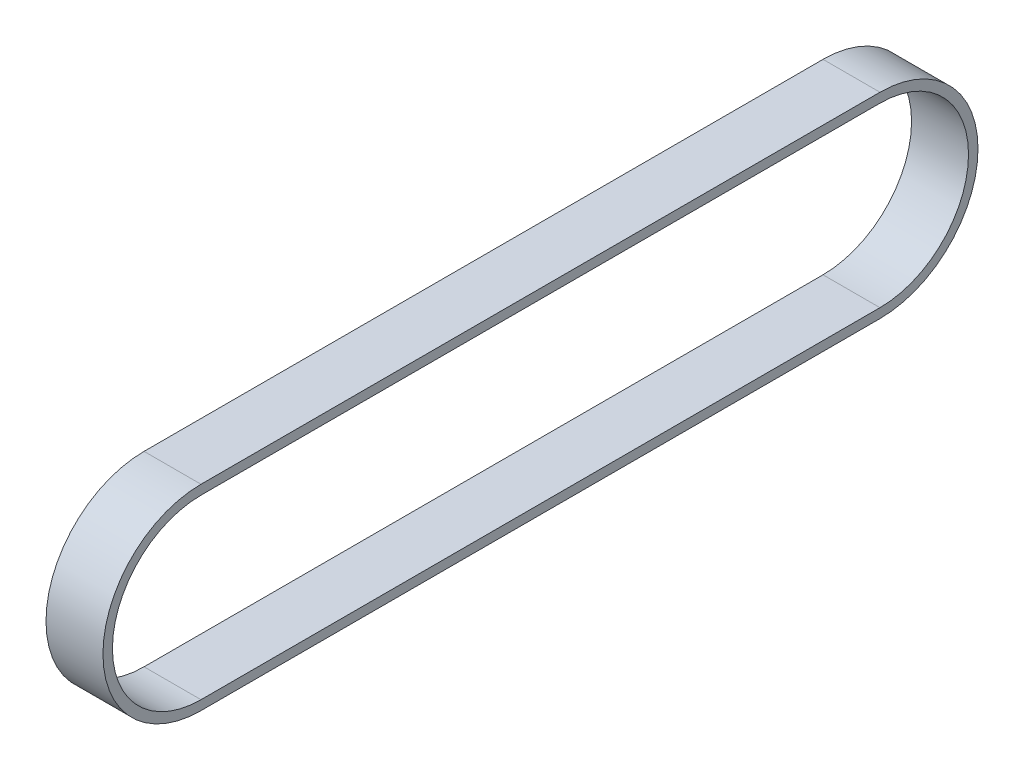
ISO-10303-21;
HEADER;
FILE_DESCRIPTION(('STEP AP214'),'2;1');
FILE_NAME('part.step','',(''),(''),'','','');
FILE_SCHEMA(('AUTOMOTIVE_DESIGN { 1 0 10303 214 1 1 1 1 }'));
ENDSEC;
DATA;
#1=APPLICATION_CONTEXT('core data for automotive mechanical design processes');
#2=APPLICATION_PROTOCOL_DEFINITION('international standard','automotive_design',2000,#1);
#3=PRODUCT_CONTEXT('',#1,'mechanical');
#4=PRODUCT('Part','Part','',(#3));
#5=PRODUCT_RELATED_PRODUCT_CATEGORY('part','',(#4));
#6=PRODUCT_DEFINITION_FORMATION('','',#4);
#7=PRODUCT_DEFINITION_CONTEXT('part definition',#1,'design');
#8=PRODUCT_DEFINITION('design','',#6,#7);
#9=PRODUCT_DEFINITION_SHAPE('','',#8);
#10=(LENGTH_UNIT() NAMED_UNIT(*) SI_UNIT(.MILLI.,.METRE.));
#11=(NAMED_UNIT(*) PLANE_ANGLE_UNIT() SI_UNIT($,.RADIAN.));
#12=(NAMED_UNIT(*) SI_UNIT($,.STERADIAN.) SOLID_ANGLE_UNIT());
#13=UNCERTAINTY_MEASURE_WITH_UNIT(LENGTH_MEASURE(1.E-05),#10,'distance_accuracy_value','');
#14=(GEOMETRIC_REPRESENTATION_CONTEXT(3) GLOBAL_UNCERTAINTY_ASSIGNED_CONTEXT((#13)) GLOBAL_UNIT_ASSIGNED_CONTEXT((#10,
#11,#12)) REPRESENTATION_CONTEXT('',''));
#15=CARTESIAN_POINT('',(0.,0.,0.));
#16=DIRECTION('',(0.,0.,1.));
#17=DIRECTION('',(1.,0.,0.));
#18=AXIS2_PLACEMENT_3D('',#15,#16,#17);
#19=CARTESIAN_POINT('',(3.,0.,71.545));
#20=DIRECTION('',(1.,0.,0.));
#21=DIRECTION('',(0.,0.,-1.));
#22=AXIS2_PLACEMENT_3D('',#19,#20,#21);
#23=PLANE('',#22);
#24=CARTESIAN_POINT('',(3.,0.,71.545));
#25=DIRECTION('',(1.,0.,0.));
#26=DIRECTION('',(0.,0.,-1.));
#27=AXIS2_PLACEMENT_3D('',#24,#25,#26);
#28=CIRCLE('',#27,10.33);
#29=CARTESIAN_POINT('',(3.,10.33,71.545));
#30=VERTEX_POINT('',#29);
#31=CARTESIAN_POINT('',(3.,-10.33,71.545));
#32=VERTEX_POINT('',#31);
#33=EDGE_CURVE('E164',#30,#32,#28,.T.);
#34=ORIENTED_EDGE('',*,*,#33,.T.);
#35=DIRECTION('',(0.,0.,-1.));
#36=VECTOR('',#35,1.);
#37=CARTESIAN_POINT('',(3.,-10.33,0.));
#38=LINE('',#37,#36);
#39=CARTESIAN_POINT('',(3.,-10.33,0.));
#40=VERTEX_POINT('',#39);
#41=EDGE_CURVE('E167',#32,#40,#38,.T.);
#42=ORIENTED_EDGE('',*,*,#41,.T.);
#43=CARTESIAN_POINT('',(3.,0.,0.));
#44=DIRECTION('',(1.,0.,0.));
#45=DIRECTION('',(0.,0.,-1.));
#46=AXIS2_PLACEMENT_3D('',#43,#44,#45);
#47=CIRCLE('',#46,10.33);
#48=CARTESIAN_POINT('',(3.,10.33,0.));
#49=VERTEX_POINT('',#48);
#50=EDGE_CURVE('E170',#40,#49,#47,.T.);
#51=ORIENTED_EDGE('',*,*,#50,.T.);
#52=DIRECTION('',(0.,0.,1.));
#53=VECTOR('',#52,1.);
#54=CARTESIAN_POINT('',(3.,10.33,71.545));
#55=LINE('',#54,#53);
#56=EDGE_CURVE('E172',#49,#30,#55,.T.);
#57=ORIENTED_EDGE('',*,*,#56,.T.);
#58=EDGE_LOOP('',(#34,#42,#51,#57));
#59=FACE_BOUND('',#58,.T.);
#60=DIRECTION('',(0.,0.,-1.));
#61=VECTOR('',#60,1.);
#62=CARTESIAN_POINT('',(3.,-9.33,0.));
#63=LINE('',#62,#61);
#64=CARTESIAN_POINT('',(3.,-9.33,71.545));
#65=VERTEX_POINT('',#64);
#66=CARTESIAN_POINT('',(3.,-9.33,0.));
#67=VERTEX_POINT('',#66);
#68=EDGE_CURVE('E136',#65,#67,#63,.T.);
#69=ORIENTED_EDGE('',*,*,#68,.F.);
#70=CARTESIAN_POINT('',(3.,0.,71.545));
#71=DIRECTION('',(1.,0.,0.));
#72=DIRECTION('',(0.,0.,-1.));
#73=AXIS2_PLACEMENT_3D('',#70,#71,#72);
#74=CIRCLE('',#73,9.33);
#75=CARTESIAN_POINT('',(3.,9.33,71.545));
#76=VERTEX_POINT('',#75);
#77=EDGE_CURVE('E128',#76,#65,#74,.T.);
#78=ORIENTED_EDGE('',*,*,#77,.F.);
#79=DIRECTION('',(0.,0.,1.));
#80=VECTOR('',#79,1.);
#81=CARTESIAN_POINT('',(3.,9.33,71.545));
#82=LINE('',#81,#80);
#83=CARTESIAN_POINT('',(3.,9.33,0.));
#84=VERTEX_POINT('',#83);
#85=EDGE_CURVE('E150',#84,#76,#82,.T.);
#86=ORIENTED_EDGE('',*,*,#85,.F.);
#87=CARTESIAN_POINT('',(3.,0.,0.));
#88=DIRECTION('',(1.,0.,0.));
#89=DIRECTION('',(0.,0.,-1.));
#90=AXIS2_PLACEMENT_3D('',#87,#88,#89);
#91=CIRCLE('',#90,9.33);
#92=EDGE_CURVE('E148',#67,#84,#91,.T.);
#93=ORIENTED_EDGE('',*,*,#92,.F.);
#94=EDGE_LOOP('',(#69,#78,#86,#93));
#95=FACE_BOUND('',#94,.T.);
#96=ADVANCED_FACE('F63',(#59,#95),#23,.T.);
#97=CARTESIAN_POINT('',(-3.,0.,71.545));
#98=DIRECTION('',(1.,0.,0.));
#99=DIRECTION('',(0.,0.,-1.));
#100=AXIS2_PLACEMENT_3D('',#97,#98,#99);
#101=PLANE('',#100);
#102=CARTESIAN_POINT('',(-3.,0.,71.545));
#103=DIRECTION('',(1.,0.,0.));
#104=DIRECTION('',(0.,0.,-1.));
#105=AXIS2_PLACEMENT_3D('',#102,#103,#104);
#106=CIRCLE('',#105,10.33);
#107=CARTESIAN_POINT('',(-3.,10.33,71.545));
#108=VERTEX_POINT('',#107);
#109=CARTESIAN_POINT('',(-3.,-10.33,71.545));
#110=VERTEX_POINT('',#109);
#111=EDGE_CURVE('E144',#108,#110,#106,.T.);
#112=ORIENTED_EDGE('',*,*,#111,.F.);
#113=DIRECTION('',(0.,0.,1.));
#114=VECTOR('',#113,1.);
#115=CARTESIAN_POINT('',(-3.,10.33,71.545));
#116=LINE('',#115,#114);
#117=CARTESIAN_POINT('',(-3.,10.33,0.));
#118=VERTEX_POINT('',#117);
#119=EDGE_CURVE('E168',#118,#108,#116,.T.);
#120=ORIENTED_EDGE('',*,*,#119,.F.);
#121=CARTESIAN_POINT('',(-3.,0.,0.));
#122=DIRECTION('',(1.,0.,0.));
#123=DIRECTION('',(0.,0.,-1.));
#124=AXIS2_PLACEMENT_3D('',#121,#122,#123);
#125=CIRCLE('',#124,10.33);
#126=CARTESIAN_POINT('',(-3.,-10.33,0.));
#127=VERTEX_POINT('',#126);
#128=EDGE_CURVE('E179',#127,#118,#125,.T.);
#129=ORIENTED_EDGE('',*,*,#128,.F.);
#130=DIRECTION('',(0.,0.,-1.));
#131=VECTOR('',#130,1.);
#132=CARTESIAN_POINT('',(-3.,-10.33,0.));
#133=LINE('',#132,#131);
#134=EDGE_CURVE('E177',#110,#127,#133,.T.);
#135=ORIENTED_EDGE('',*,*,#134,.F.);
#136=EDGE_LOOP('',(#112,#120,#129,#135));
#137=FACE_BOUND('',#136,.T.);
#138=CARTESIAN_POINT('',(-3.,0.,71.545));
#139=DIRECTION('',(1.,0.,0.));
#140=DIRECTION('',(0.,0.,-1.));
#141=AXIS2_PLACEMENT_3D('',#138,#139,#140);
#142=CIRCLE('',#141,9.33);
#143=CARTESIAN_POINT('',(-3.,9.33,71.545));
#144=VERTEX_POINT('',#143);
#145=CARTESIAN_POINT('',(-3.,-9.33,71.545));
#146=VERTEX_POINT('',#145);
#147=EDGE_CURVE('E86',#144,#146,#142,.T.);
#148=ORIENTED_EDGE('',*,*,#147,.T.);
#149=DIRECTION('',(0.,0.,-1.));
#150=VECTOR('',#149,1.);
#151=CARTESIAN_POINT('',(-3.,-9.33,0.));
#152=LINE('',#151,#150);
#153=CARTESIAN_POINT('',(-3.,-9.33,0.));
#154=VERTEX_POINT('',#153);
#155=EDGE_CURVE('E143',#146,#154,#152,.T.);
#156=ORIENTED_EDGE('',*,*,#155,.T.);
#157=CARTESIAN_POINT('',(-3.,0.,0.));
#158=DIRECTION('',(1.,0.,0.));
#159=DIRECTION('',(0.,0.,-1.));
#160=AXIS2_PLACEMENT_3D('',#157,#158,#159);
#161=CIRCLE('',#160,9.33);
#162=CARTESIAN_POINT('',(-3.,9.33,0.));
#163=VERTEX_POINT('',#162);
#164=EDGE_CURVE('E156',#154,#163,#161,.T.);
#165=ORIENTED_EDGE('',*,*,#164,.T.);
#166=DIRECTION('',(0.,0.,1.));
#167=VECTOR('',#166,1.);
#168=CARTESIAN_POINT('',(-3.,9.33,71.545));
#169=LINE('',#168,#167);
#170=EDGE_CURVE('E137',#163,#144,#169,.T.);
#171=ORIENTED_EDGE('',*,*,#170,.T.);
#172=EDGE_LOOP('',(#148,#156,#165,#171));
#173=FACE_BOUND('',#172,.T.);
#174=ADVANCED_FACE('F197',(#137,#173),#101,.F.);
#175=CARTESIAN_POINT('',(3.,0.,71.545));
#176=DIRECTION('',(-1.,0.,0.));
#177=DIRECTION('',(0.,0.,1.));
#178=AXIS2_PLACEMENT_3D('',#175,#176,#177);
#179=CYLINDRICAL_SURFACE('',#178,10.33);
#180=ORIENTED_EDGE('',*,*,#111,.T.);
#181=DIRECTION('',(-1.,0.,0.));
#182=VECTOR('',#181,1.);
#183=CARTESIAN_POINT('',(3.,-10.33,71.545));
#184=LINE('',#183,#182);
#185=EDGE_CURVE('E12',#32,#110,#184,.T.);
#186=ORIENTED_EDGE('',*,*,#185,.F.);
#187=ORIENTED_EDGE('',*,*,#33,.F.);
#188=DIRECTION('',(-1.,0.,0.));
#189=VECTOR('',#188,1.);
#190=CARTESIAN_POINT('',(3.,10.33,71.545));
#191=LINE('',#190,#189);
#192=EDGE_CURVE('E174',#30,#108,#191,.T.);
#193=ORIENTED_EDGE('',*,*,#192,.T.);
#194=EDGE_LOOP('',(#180,#186,#187,#193));
#195=FACE_BOUND('',#194,.T.);
#196=ADVANCED_FACE('F65',(#195),#179,.T.);
#197=CARTESIAN_POINT('',(3.,-10.33,0.));
#198=DIRECTION('',(0.,1.,0.));
#199=DIRECTION('',(0.,0.,1.));
#200=AXIS2_PLACEMENT_3D('',#197,#198,#199);
#201=PLANE('',#200);
#202=ORIENTED_EDGE('',*,*,#134,.T.);
#203=DIRECTION('',(-1.,0.,0.));
#204=VECTOR('',#203,1.);
#205=CARTESIAN_POINT('',(3.,-10.33,0.));
#206=LINE('',#205,#204);
#207=EDGE_CURVE('E71',#40,#127,#206,.T.);
#208=ORIENTED_EDGE('',*,*,#207,.F.);
#209=ORIENTED_EDGE('',*,*,#41,.F.);
#210=ORIENTED_EDGE('',*,*,#185,.T.);
#211=EDGE_LOOP('',(#202,#208,#209,#210));
#212=FACE_BOUND('',#211,.T.);
#213=ADVANCED_FACE('F207',(#212),#201,.F.);
#214=CARTESIAN_POINT('',(3.,0.,0.));
#215=DIRECTION('',(-1.,0.,0.));
#216=DIRECTION('',(0.,0.,1.));
#217=AXIS2_PLACEMENT_3D('',#214,#215,#216);
#218=CYLINDRICAL_SURFACE('',#217,10.33);
#219=ORIENTED_EDGE('',*,*,#128,.T.);
#220=DIRECTION('',(-1.,0.,0.));
#221=VECTOR('',#220,1.);
#222=CARTESIAN_POINT('',(3.,10.33,0.));
#223=LINE('',#222,#221);
#224=EDGE_CURVE('E184',#49,#118,#223,.T.);
#225=ORIENTED_EDGE('',*,*,#224,.F.);
#226=ORIENTED_EDGE('',*,*,#50,.F.);
#227=ORIENTED_EDGE('',*,*,#207,.T.);
#228=EDGE_LOOP('',(#219,#225,#226,#227));
#229=FACE_BOUND('',#228,.T.);
#230=ADVANCED_FACE('F191',(#229),#218,.T.);
#231=CARTESIAN_POINT('',(3.,10.33,71.545));
#232=DIRECTION('',(0.,-1.,0.));
#233=DIRECTION('',(0.,0.,-1.));
#234=AXIS2_PLACEMENT_3D('',#231,#232,#233);
#235=PLANE('',#234);
#236=ORIENTED_EDGE('',*,*,#119,.T.);
#237=ORIENTED_EDGE('',*,*,#192,.F.);
#238=ORIENTED_EDGE('',*,*,#56,.F.);
#239=ORIENTED_EDGE('',*,*,#224,.T.);
#240=EDGE_LOOP('',(#236,#237,#238,#239));
#241=FACE_BOUND('',#240,.T.);
#242=ADVANCED_FACE('F201',(#241),#235,.F.);
#243=CARTESIAN_POINT('',(3.,0.,71.545));
#244=DIRECTION('',(-1.,0.,0.));
#245=DIRECTION('',(0.,0.,1.));
#246=AXIS2_PLACEMENT_3D('',#243,#244,#245);
#247=CYLINDRICAL_SURFACE('',#246,9.33);
#248=ORIENTED_EDGE('',*,*,#147,.F.);
#249=DIRECTION('',(-1.,0.,0.));
#250=VECTOR('',#249,1.);
#251=CARTESIAN_POINT('',(3.,9.33,71.545));
#252=LINE('',#251,#250);
#253=EDGE_CURVE('E132',#76,#144,#252,.T.);
#254=ORIENTED_EDGE('',*,*,#253,.F.);
#255=ORIENTED_EDGE('',*,*,#77,.T.);
#256=DIRECTION('',(-1.,0.,0.));
#257=VECTOR('',#256,1.);
#258=CARTESIAN_POINT('',(3.,-9.33,71.545));
#259=LINE('',#258,#257);
#260=EDGE_CURVE('E131',#65,#146,#259,.T.);
#261=ORIENTED_EDGE('',*,*,#260,.T.);
#262=EDGE_LOOP('',(#248,#254,#255,#261));
#263=FACE_BOUND('',#262,.T.);
#264=ADVANCED_FACE('F130',(#263),#247,.F.);
#265=CARTESIAN_POINT('',(3.,-9.33,0.));
#266=DIRECTION('',(0.,1.,0.));
#267=DIRECTION('',(0.,0.,1.));
#268=AXIS2_PLACEMENT_3D('',#265,#266,#267);
#269=PLANE('',#268);
#270=ORIENTED_EDGE('',*,*,#155,.F.);
#271=ORIENTED_EDGE('',*,*,#260,.F.);
#272=ORIENTED_EDGE('',*,*,#68,.T.);
#273=DIRECTION('',(-1.,0.,0.));
#274=VECTOR('',#273,1.);
#275=CARTESIAN_POINT('',(3.,-9.33,0.));
#276=LINE('',#275,#274);
#277=EDGE_CURVE('E145',#67,#154,#276,.T.);
#278=ORIENTED_EDGE('',*,*,#277,.T.);
#279=EDGE_LOOP('',(#270,#271,#272,#278));
#280=FACE_BOUND('',#279,.T.);
#281=ADVANCED_FACE('F140',(#280),#269,.T.);
#282=CARTESIAN_POINT('',(3.,0.,0.));
#283=DIRECTION('',(-1.,0.,0.));
#284=DIRECTION('',(0.,0.,1.));
#285=AXIS2_PLACEMENT_3D('',#282,#283,#284);
#286=CYLINDRICAL_SURFACE('',#285,9.33);
#287=ORIENTED_EDGE('',*,*,#164,.F.);
#288=ORIENTED_EDGE('',*,*,#277,.F.);
#289=ORIENTED_EDGE('',*,*,#92,.T.);
#290=DIRECTION('',(-1.,0.,0.));
#291=VECTOR('',#290,1.);
#292=CARTESIAN_POINT('',(3.,9.33,0.));
#293=LINE('',#292,#291);
#294=EDGE_CURVE('E78',#84,#163,#293,.T.);
#295=ORIENTED_EDGE('',*,*,#294,.T.);
#296=EDGE_LOOP('',(#287,#288,#289,#295));
#297=FACE_BOUND('',#296,.T.);
#298=ADVANCED_FACE('F230',(#297),#286,.F.);
#299=CARTESIAN_POINT('',(3.,9.33,71.545));
#300=DIRECTION('',(0.,-1.,0.));
#301=DIRECTION('',(0.,0.,-1.));
#302=AXIS2_PLACEMENT_3D('',#299,#300,#301);
#303=PLANE('',#302);
#304=ORIENTED_EDGE('',*,*,#170,.F.);
#305=ORIENTED_EDGE('',*,*,#294,.F.);
#306=ORIENTED_EDGE('',*,*,#85,.T.);
#307=ORIENTED_EDGE('',*,*,#253,.T.);
#308=EDGE_LOOP('',(#304,#305,#306,#307));
#309=FACE_BOUND('',#308,.T.);
#310=ADVANCED_FACE('F234',(#309),#303,.T.);
#311=CLOSED_SHELL('',(#96,#174,#196,#213,#230,#242,#264,#281,#298,#310));
#312=MANIFOLD_SOLID_BREP('B2',#311);
#313=ADVANCED_BREP_SHAPE_REPRESENTATION('',(#18,#312),#14);
#314=SHAPE_DEFINITION_REPRESENTATION(#9,#313);
ENDSEC;
END-ISO-10303-21;
